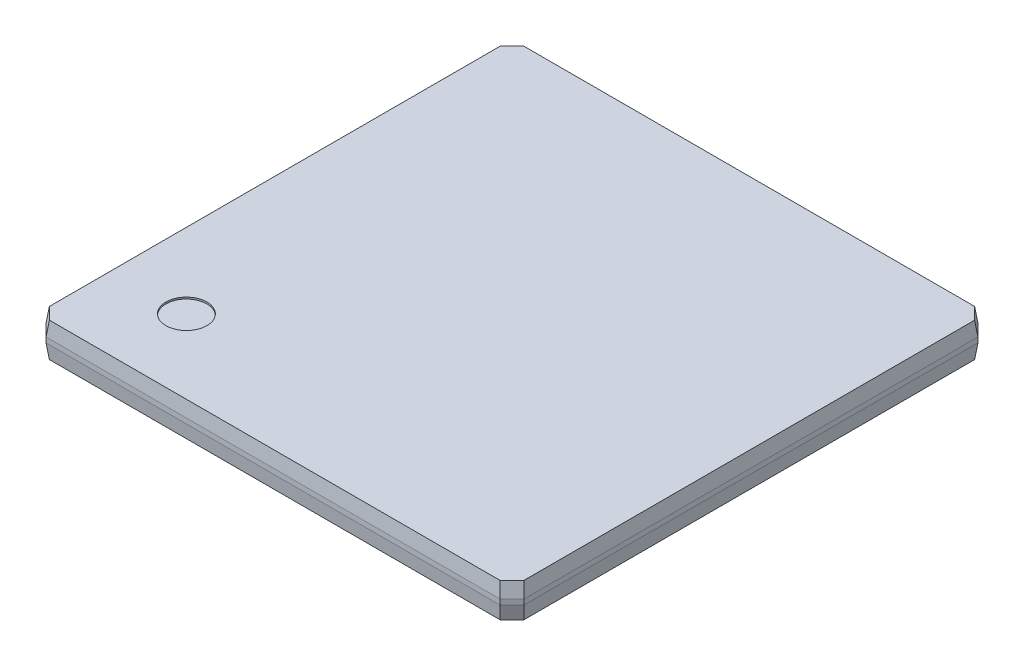
ISO-10303-21;
HEADER;
FILE_DESCRIPTION(('STEP AP214'),'2;1');
FILE_NAME('part.step','',(''),(''),'','','');
FILE_SCHEMA(('AUTOMOTIVE_DESIGN { 1 0 10303 214 1 1 1 1 }'));
ENDSEC;
DATA;
#1=APPLICATION_CONTEXT('core data for automotive mechanical design processes');
#2=APPLICATION_PROTOCOL_DEFINITION('international standard','automotive_design',2000,#1);
#3=PRODUCT_CONTEXT('',#1,'mechanical');
#4=PRODUCT('Part','Part','',(#3));
#5=PRODUCT_RELATED_PRODUCT_CATEGORY('part','',(#4));
#6=PRODUCT_DEFINITION_FORMATION('','',#4);
#7=PRODUCT_DEFINITION_CONTEXT('part definition',#1,'design');
#8=PRODUCT_DEFINITION('design','',#6,#7);
#9=PRODUCT_DEFINITION_SHAPE('','',#8);
#10=(LENGTH_UNIT() NAMED_UNIT(*) SI_UNIT(.MILLI.,.METRE.));
#11=(NAMED_UNIT(*) PLANE_ANGLE_UNIT() SI_UNIT($,.RADIAN.));
#12=(NAMED_UNIT(*) SI_UNIT($,.STERADIAN.) SOLID_ANGLE_UNIT());
#13=UNCERTAINTY_MEASURE_WITH_UNIT(LENGTH_MEASURE(1.E-05),#10,'distance_accuracy_value','');
#14=(GEOMETRIC_REPRESENTATION_CONTEXT(3) GLOBAL_UNCERTAINTY_ASSIGNED_CONTEXT((#13)) GLOBAL_UNIT_ASSIGNED_CONTEXT((#10,
#11,#12)) REPRESENTATION_CONTEXT('',''));
#15=CARTESIAN_POINT('',(0.,0.,0.));
#16=DIRECTION('',(0.,0.,1.));
#17=DIRECTION('',(1.,0.,0.));
#18=AXIS2_PLACEMENT_3D('',#15,#16,#17);
#19=CARTESIAN_POINT('',(80.7672796453876,171.356668809019,4.76220926821013));
#20=DIRECTION('',(0.,-1.,0.));
#21=DIRECTION('',(1.,0.,0.));
#22=AXIS2_PLACEMENT_3D('',#19,#20,#21);
#23=CYLINDRICAL_SURFACE('',#22,0.599999999999989);
#24=CARTESIAN_POINT('',(80.7672796453876,171.356415940122,4.76220926821013));
#25=DIRECTION('',(0.,-1.,0.));
#26=DIRECTION('',(1.,0.,0.));
#27=AXIS2_PLACEMENT_3D('',#24,#25,#26);
#28=CIRCLE('',#27,0.599999999999989);
#29=CARTESIAN_POINT('',(80.1672796453876,171.356415940122,4.76220926821013));
#30=VERTEX_POINT('',#29);
#31=CARTESIAN_POINT('',(81.3672796453876,171.356415940122,4.76220926821013));
#32=VERTEX_POINT('',#31);
#33=EDGE_CURVE('E11',#30,#32,#28,.T.);
#34=ORIENTED_EDGE('',*,*,#33,.F.);
#35=DIRECTION('',(0.,-1.,0.));
#36=VECTOR('',#35,1.);
#37=CARTESIAN_POINT('',(80.1672796453876,171.356668809019,4.76220926821013));
#38=LINE('',#37,#36);
#39=CARTESIAN_POINT('',(80.1672796453876,171.306668809019,4.76220926821013));
#40=VERTEX_POINT('',#39);
#41=EDGE_CURVE('E24',#30,#40,#38,.T.);
#42=ORIENTED_EDGE('',*,*,#41,.T.);
#43=CARTESIAN_POINT('',(80.7672796453876,171.306668809019,4.76220926821013));
#44=DIRECTION('',(0.,1.,0.));
#45=DIRECTION('',(1.,0.,0.));
#46=AXIS2_PLACEMENT_3D('',#43,#44,#45);
#47=CIRCLE('',#46,0.599999999999989);
#48=CARTESIAN_POINT('',(81.3672796453876,171.306668809019,4.76220926821013));
#49=VERTEX_POINT('',#48);
#50=EDGE_CURVE('E310',#49,#40,#47,.T.);
#51=ORIENTED_EDGE('',*,*,#50,.F.);
#52=DIRECTION('',(0.,-1.,0.));
#53=VECTOR('',#52,1.);
#54=CARTESIAN_POINT('',(81.3672796453876,171.356668809019,4.76220926821013));
#55=LINE('',#54,#53);
#56=EDGE_CURVE('E37',#32,#49,#55,.T.);
#57=ORIENTED_EDGE('',*,*,#56,.F.);
#58=EDGE_LOOP('',(#34,#42,#51,#57));
#59=FACE_BOUND('',#58,.T.);
#60=ADVANCED_FACE('F17',(#59),#23,.F.);
#61=CARTESIAN_POINT('',(85.5226880897936,170.356415940122,-0.0195057377945647));
#62=DIRECTION('',(0.,-1.,0.));
#63=DIRECTION('',(1.,0.,0.));
#64=AXIS2_PLACEMENT_3D('',#61,#62,#63);
#65=PLANE('',#64);
#66=DIRECTION('',(0.,0.,1.));
#67=VECTOR('',#66,1.);
#68=CARTESIAN_POINT('',(92.4726880897936,170.356415940122,-0.0195057377945647));
#69=LINE('',#68,#67);
#70=CARTESIAN_POINT('',(92.4726880897936,170.356415940122,-6.6195057377946));
#71=VERTEX_POINT('',#70);
#72=CARTESIAN_POINT('',(92.4726880897936,170.356415940122,6.5804942622055));
#73=VERTEX_POINT('',#72);
#74=EDGE_CURVE('E307',#71,#73,#69,.T.);
#75=ORIENTED_EDGE('',*,*,#74,.T.);
#76=DIRECTION('',(-0.707106781186596,0.,0.707106781186499));
#77=VECTOR('',#76,1.);
#78=CARTESIAN_POINT('',(92.4726880897937,170.356415940122,6.58049426220548));
#79=LINE('',#78,#77);
#80=CARTESIAN_POINT('',(92.1226880897937,170.356415940122,6.93049426220545));
#81=VERTEX_POINT('',#80);
#82=EDGE_CURVE('E305',#73,#81,#79,.T.);
#83=ORIENTED_EDGE('',*,*,#82,.T.);
#84=DIRECTION('',(-1.,0.,0.));
#85=VECTOR('',#84,1.);
#86=CARTESIAN_POINT('',(85.5226880897936,170.356415940122,6.93049426220545));
#87=LINE('',#86,#85);
#88=CARTESIAN_POINT('',(78.9226880897936,170.356415940122,6.93049426220545));
#89=VERTEX_POINT('',#88);
#90=EDGE_CURVE('E303',#81,#89,#87,.T.);
#91=ORIENTED_EDGE('',*,*,#90,.T.);
#92=DIRECTION('',(-0.707106781186547,0.,-0.707106781186548));
#93=VECTOR('',#92,1.);
#94=CARTESIAN_POINT('',(78.9226880897936,170.356415940122,6.93049426220547));
#95=LINE('',#94,#93);
#96=CARTESIAN_POINT('',(78.5726880897936,170.356415940122,6.58049426220548));
#97=VERTEX_POINT('',#96);
#98=EDGE_CURVE('E301',#89,#97,#95,.T.);
#99=ORIENTED_EDGE('',*,*,#98,.T.);
#100=DIRECTION('',(0.,0.,-1.));
#101=VECTOR('',#100,1.);
#102=CARTESIAN_POINT('',(78.5726880897936,170.356415940122,-0.0195057377945647));
#103=LINE('',#102,#101);
#104=CARTESIAN_POINT('',(78.5726880897936,170.356415940122,-6.61950573779457));
#105=VERTEX_POINT('',#104);
#106=EDGE_CURVE('E299',#97,#105,#103,.T.);
#107=ORIENTED_EDGE('',*,*,#106,.T.);
#108=DIRECTION('',(0.707106781186536,0.,-0.707106781186559));
#109=VECTOR('',#108,1.);
#110=CARTESIAN_POINT('',(78.5726880897936,170.356415940122,-6.61950573779457));
#111=LINE('',#110,#109);
#112=CARTESIAN_POINT('',(78.9226880897936,170.356415940122,-6.96950573779457));
#113=VERTEX_POINT('',#112);
#114=EDGE_CURVE('E297',#105,#113,#111,.T.);
#115=ORIENTED_EDGE('',*,*,#114,.T.);
#116=DIRECTION('',(1.,0.,0.));
#117=VECTOR('',#116,1.);
#118=CARTESIAN_POINT('',(85.5226880897936,170.356415940122,-6.96950573779457));
#119=LINE('',#118,#117);
#120=CARTESIAN_POINT('',(92.1226880897936,170.356415940122,-6.96950573779458));
#121=VERTEX_POINT('',#120);
#122=EDGE_CURVE('E295',#113,#121,#119,.T.);
#123=ORIENTED_EDGE('',*,*,#122,.T.);
#124=DIRECTION('',(0.707106781186564,0.,0.707106781186531));
#125=VECTOR('',#124,1.);
#126=CARTESIAN_POINT('',(92.1226880897936,170.356415940122,-6.9695057377946));
#127=LINE('',#126,#125);
#128=EDGE_CURVE('E292',#121,#71,#127,.T.);
#129=ORIENTED_EDGE('',*,*,#128,.T.);
#130=EDGE_LOOP('',(#75,#83,#91,#99,#107,#115,#123,#129));
#131=FACE_BOUND('',#130,.T.);
#132=ADVANCED_FACE('F323',(#131),#65,.T.);
#133=CARTESIAN_POINT('',(92.3226880897936,170.568915940122,6.78049426220546));
#134=DIRECTION('',(-0.697518448882894,0.164121987972366,-0.697518448882895));
#135=DIRECTION('',(-0.707106781186548,0.,0.707106781186547));
#136=AXIS2_PLACEMENT_3D('',#133,#134,#135);
#137=PLANE('',#136);
#138=DIRECTION('',(0.116051770637077,0.986440050415634,0.116051770637077));
#139=VECTOR('',#138,1.);
#140=CARTESIAN_POINT('',(92.1476880897936,170.568915940122,6.95549426220541));
#141=LINE('',#140,#139);
#142=CARTESIAN_POINT('',(92.1726880897936,170.781415940122,6.98049426220541));
#143=VERTEX_POINT('',#142);
#144=EDGE_CURVE('E290',#81,#143,#141,.T.);
#145=ORIENTED_EDGE('',*,*,#144,.F.);
#146=ORIENTED_EDGE('',*,*,#82,.F.);
#147=DIRECTION('',(-0.116051770637077,-0.986440050415634,-0.116051770637077));
#148=VECTOR('',#147,1.);
#149=CARTESIAN_POINT('',(92.4976880897936,170.568915940122,6.60549426220545));
#150=LINE('',#149,#148);
#151=CARTESIAN_POINT('',(92.5226880897936,170.781415940122,6.63049426220542));
#152=VERTEX_POINT('',#151);
#153=EDGE_CURVE('E287',#152,#73,#150,.T.);
#154=ORIENTED_EDGE('',*,*,#153,.F.);
#155=DIRECTION('',(0.707106781186548,0.,-0.707106781186547));
#156=VECTOR('',#155,1.);
#157=CARTESIAN_POINT('',(92.3476880897936,170.781415940122,6.80549426220545));
#158=LINE('',#157,#156);
#159=EDGE_CURVE('E284',#143,#152,#158,.T.);
#160=ORIENTED_EDGE('',*,*,#159,.F.);
#161=EDGE_LOOP('',(#145,#146,#154,#160));
#162=FACE_BOUND('',#161,.T.);
#163=ADVANCED_FACE('F327',(#162),#137,.F.);
#164=CARTESIAN_POINT('',(92.4976880897936,170.568915940122,-0.0195057377945549));
#165=DIRECTION('',(-0.993150604322885,0.116841247567319,0.));
#166=DIRECTION('',(-0.116841247567319,-0.993150604322885,0.));
#167=AXIS2_PLACEMENT_3D('',#164,#165,#166);
#168=PLANE('',#167);
#169=ORIENTED_EDGE('',*,*,#153,.T.);
#170=ORIENTED_EDGE('',*,*,#74,.F.);
#171=DIRECTION('',(-0.116051770637054,-0.986440050415638,0.116051770637062));
#172=VECTOR('',#171,1.);
#173=CARTESIAN_POINT('',(92.5226880897935,170.781415940122,-6.66950573779457));
#174=LINE('',#173,#172);
#175=CARTESIAN_POINT('',(92.5226880897935,170.781415940122,-6.6695057377946));
#176=VERTEX_POINT('',#175);
#177=EDGE_CURVE('E281',#176,#71,#174,.T.);
#178=ORIENTED_EDGE('',*,*,#177,.F.);
#179=DIRECTION('',(0.,0.,-1.));
#180=VECTOR('',#179,1.);
#181=CARTESIAN_POINT('',(92.5226880897935,170.781415940122,-0.0195057377945549));
#182=LINE('',#181,#180);
#183=EDGE_CURVE('E278',#152,#176,#182,.T.);
#184=ORIENTED_EDGE('',*,*,#183,.F.);
#185=EDGE_LOOP('',(#169,#170,#178,#184));
#186=FACE_BOUND('',#185,.T.);
#187=ADVANCED_FACE('F332',(#186),#168,.F.);
#188=CARTESIAN_POINT('',(92.3226880897936,170.568915940122,-6.81950573779458));
#189=DIRECTION('',(-0.697518448882897,0.164121987972341,0.697518448882898));
#190=DIRECTION('',(0.707106781186548,0.,0.707106781186547));
#191=AXIS2_PLACEMENT_3D('',#188,#189,#190);
#192=PLANE('',#191);
#193=ORIENTED_EDGE('',*,*,#177,.T.);
#194=ORIENTED_EDGE('',*,*,#128,.F.);
#195=DIRECTION('',(-0.116051770637059,-0.986440050415638,0.116051770637059));
#196=VECTOR('',#195,1.);
#197=CARTESIAN_POINT('',(92.1476880897936,170.568915940122,-6.99450573779456));
#198=LINE('',#197,#196);
#199=CARTESIAN_POINT('',(92.1726880897936,170.781415940122,-7.01950573779459));
#200=VERTEX_POINT('',#199);
#201=EDGE_CURVE('E275',#200,#121,#198,.T.);
#202=ORIENTED_EDGE('',*,*,#201,.F.);
#203=DIRECTION('',(-0.707106781186548,0.,-0.707106781186547));
#204=VECTOR('',#203,1.);
#205=CARTESIAN_POINT('',(92.3476880897936,170.781415940122,-6.84450573779456));
#206=LINE('',#205,#204);
#207=EDGE_CURVE('E272',#176,#200,#206,.T.);
#208=ORIENTED_EDGE('',*,*,#207,.F.);
#209=EDGE_LOOP('',(#193,#194,#202,#208));
#210=FACE_BOUND('',#209,.T.);
#211=ADVANCED_FACE('F338',(#210),#192,.F.);
#212=CARTESIAN_POINT('',(85.5226880897936,170.568915940122,-6.99450573779457));
#213=DIRECTION('',(0.,0.116841247567315,0.993150604322886));
#214=DIRECTION('',(0.,-0.993150604322886,0.116841247567315));
#215=AXIS2_PLACEMENT_3D('',#212,#213,#214);
#216=PLANE('',#215);
#217=ORIENTED_EDGE('',*,*,#201,.T.);
#218=ORIENTED_EDGE('',*,*,#122,.F.);
#219=DIRECTION('',(0.116051770637118,-0.986440050415632,0.11605177063705));
#220=VECTOR('',#219,1.);
#221=CARTESIAN_POINT('',(78.8726880897936,170.781415940122,-7.01950573779455));
#222=LINE('',#221,#220);
#223=CARTESIAN_POINT('',(78.8726880897935,170.781415940122,-7.0195057377946));
#224=VERTEX_POINT('',#223);
#225=EDGE_CURVE('E269',#224,#113,#222,.T.);
#226=ORIENTED_EDGE('',*,*,#225,.F.);
#227=DIRECTION('',(-1.,0.,0.));
#228=VECTOR('',#227,1.);
#229=CARTESIAN_POINT('',(85.5226880897936,170.781415940122,-7.01950573779455));
#230=LINE('',#229,#228);
#231=EDGE_CURVE('E266',#200,#224,#230,.T.);
#232=ORIENTED_EDGE('',*,*,#231,.F.);
#233=EDGE_LOOP('',(#217,#218,#226,#232));
#234=FACE_BOUND('',#233,.T.);
#235=ADVANCED_FACE('F342',(#234),#216,.F.);
#236=CARTESIAN_POINT('',(78.7226880897936,170.568915940122,-6.81950573779456));
#237=DIRECTION('',(0.697518448882883,0.164121987972467,0.697518448882883));
#238=DIRECTION('',(0.707106781186548,0.,-0.707106781186548));
#239=AXIS2_PLACEMENT_3D('',#236,#237,#238);
#240=PLANE('',#239);
#241=ORIENTED_EDGE('',*,*,#225,.T.);
#242=ORIENTED_EDGE('',*,*,#114,.F.);
#243=DIRECTION('',(0.116051770637148,-0.986440050415617,0.116051770637148));
#244=VECTOR('',#243,1.);
#245=CARTESIAN_POINT('',(78.5476880897936,170.568915940122,-6.64450573779457));
#246=LINE('',#245,#244);
#247=CARTESIAN_POINT('',(78.5226880897936,170.781415940122,-6.66950573779462));
#248=VERTEX_POINT('',#247);
#249=EDGE_CURVE('E263',#248,#105,#246,.T.);
#250=ORIENTED_EDGE('',*,*,#249,.F.);
#251=DIRECTION('',(-0.707106781186548,0.,0.707106781186548));
#252=VECTOR('',#251,1.);
#253=CARTESIAN_POINT('',(78.6976880897936,170.781415940122,-6.84450573779456));
#254=LINE('',#253,#252);
#255=EDGE_CURVE('E260',#224,#248,#254,.T.);
#256=ORIENTED_EDGE('',*,*,#255,.F.);
#257=EDGE_LOOP('',(#241,#242,#250,#256));
#258=FACE_BOUND('',#257,.T.);
#259=ADVANCED_FACE('F346',(#258),#240,.F.);
#260=CARTESIAN_POINT('',(78.5476880897936,170.568915940122,-0.0195057377945593));
#261=DIRECTION('',(0.993150604322868,0.116841247567469,0.));
#262=DIRECTION('',(-0.116841247567469,0.993150604322868,0.));
#263=AXIS2_PLACEMENT_3D('',#260,#261,#262);
#264=PLANE('',#263);
#265=ORIENTED_EDGE('',*,*,#249,.T.);
#266=ORIENTED_EDGE('',*,*,#106,.F.);
#267=DIRECTION('',(0.116051770637182,-0.986440050415624,-0.116051770637059));
#268=VECTOR('',#267,1.);
#269=CARTESIAN_POINT('',(78.5226880897935,170.781415940122,6.63049426220545));
#270=LINE('',#269,#268);
#271=CARTESIAN_POINT('',(78.5226880897936,170.781415940122,6.63049426220542));
#272=VERTEX_POINT('',#271);
#273=EDGE_CURVE('E257',#272,#97,#270,.T.);
#274=ORIENTED_EDGE('',*,*,#273,.F.);
#275=DIRECTION('',(0.,0.,1.));
#276=VECTOR('',#275,1.);
#277=CARTESIAN_POINT('',(78.5226880897935,170.781415940122,-0.0195057377945593));
#278=LINE('',#277,#276);
#279=EDGE_CURVE('E254',#248,#272,#278,.T.);
#280=ORIENTED_EDGE('',*,*,#279,.F.);
#281=EDGE_LOOP('',(#265,#266,#274,#280));
#282=FACE_BOUND('',#281,.T.);
#283=ADVANCED_FACE('F350',(#282),#264,.F.);
#284=CARTESIAN_POINT('',(78.7226880897936,170.568915940122,6.78049426220546));
#285=DIRECTION('',(0.697518448882886,0.164121987972441,-0.697518448882885));
#286=DIRECTION('',(-0.707106781186547,0.,-0.707106781186548));
#287=AXIS2_PLACEMENT_3D('',#284,#285,#286);
#288=PLANE('',#287);
#289=ORIENTED_EDGE('',*,*,#273,.T.);
#290=ORIENTED_EDGE('',*,*,#98,.F.);
#291=DIRECTION('',(0.11605177063713,-0.986440050415622,-0.11605177063713));
#292=VECTOR('',#291,1.);
#293=CARTESIAN_POINT('',(78.8976880897936,170.568915940122,6.95549426220545));
#294=LINE('',#293,#292);
#295=CARTESIAN_POINT('',(78.8726880897936,170.781415940122,6.98049426220541));
#296=VERTEX_POINT('',#295);
#297=EDGE_CURVE('E251',#296,#89,#294,.T.);
#298=ORIENTED_EDGE('',*,*,#297,.F.);
#299=DIRECTION('',(0.707106781186547,0.,0.707106781186548));
#300=VECTOR('',#299,1.);
#301=CARTESIAN_POINT('',(78.6976880897936,170.781415940122,6.80549426220546));
#302=LINE('',#301,#300);
#303=EDGE_CURVE('E248',#272,#296,#302,.T.);
#304=ORIENTED_EDGE('',*,*,#303,.F.);
#305=EDGE_LOOP('',(#289,#290,#298,#304));
#306=FACE_BOUND('',#305,.T.);
#307=ADVANCED_FACE('F354',(#306),#288,.F.);
#308=CARTESIAN_POINT('',(85.5226880897936,170.568915940122,6.95549426220545));
#309=DIRECTION('',(0.,0.116841247567396,-0.993150604322876));
#310=DIRECTION('',(0.,0.993150604322876,0.116841247567396));
#311=AXIS2_PLACEMENT_3D('',#308,#309,#310);
#312=PLANE('',#311);
#313=ORIENTED_EDGE('',*,*,#297,.T.);
#314=ORIENTED_EDGE('',*,*,#90,.F.);
#315=ORIENTED_EDGE('',*,*,#144,.T.);
#316=DIRECTION('',(1.,0.,0.));
#317=VECTOR('',#316,1.);
#318=CARTESIAN_POINT('',(85.5226880897936,170.781415940122,6.98049426220545));
#319=LINE('',#318,#317);
#320=EDGE_CURVE('E245',#296,#143,#319,.T.);
#321=ORIENTED_EDGE('',*,*,#320,.F.);
#322=EDGE_LOOP('',(#313,#314,#315,#321));
#323=FACE_BOUND('',#322,.T.);
#324=ADVANCED_FACE('F358',(#323),#312,.F.);
#325=CARTESIAN_POINT('',(92.3476880897936,170.781415940122,6.80549426220539));
#326=DIRECTION('',(0.707106781186547,0.,0.707106781186548));
#327=DIRECTION('',(0.707106781186548,0.,-0.707106781186547));
#328=AXIS2_PLACEMENT_3D('',#325,#326,#327);
#329=PLANE('',#328);
#330=ORIENTED_EDGE('',*,*,#159,.T.);
#331=DIRECTION('',(0.,1.,0.));
#332=VECTOR('',#331,1.);
#333=CARTESIAN_POINT('',(92.5226880897935,170.781415940122,6.63049426220542));
#334=LINE('',#333,#332);
#335=CARTESIAN_POINT('',(92.5226880897935,170.931415940122,6.63049426220539));
#336=VERTEX_POINT('',#335);
#337=EDGE_CURVE('E243',#152,#336,#334,.T.);
#338=ORIENTED_EDGE('',*,*,#337,.T.);
#339=DIRECTION('',(-0.707106781186548,0.,0.707106781186547));
#340=VECTOR('',#339,1.);
#341=CARTESIAN_POINT('',(92.3476880897936,170.931415940122,6.80549426220539));
#342=LINE('',#341,#340);
#343=CARTESIAN_POINT('',(92.1726880897936,170.931415940122,6.98049426220534));
#344=VERTEX_POINT('',#343);
#345=EDGE_CURVE('E241',#336,#344,#342,.T.);
#346=ORIENTED_EDGE('',*,*,#345,.T.);
#347=DIRECTION('',(0.,-1.,0.));
#348=VECTOR('',#347,1.);
#349=CARTESIAN_POINT('',(92.1726880897936,170.781415940122,6.9804942622054));
#350=LINE('',#349,#348);
#351=EDGE_CURVE('E238',#344,#143,#350,.T.);
#352=ORIENTED_EDGE('',*,*,#351,.T.);
#353=EDGE_LOOP('',(#330,#338,#346,#352));
#354=FACE_BOUND('',#353,.T.);
#355=ADVANCED_FACE('F362',(#354),#329,.T.);
#356=CARTESIAN_POINT('',(92.5226880897936,170.781415940122,-0.0195057377946242));
#357=DIRECTION('',(1.,0.,0.));
#358=DIRECTION('',(0.,0.,-1.));
#359=AXIS2_PLACEMENT_3D('',#356,#357,#358);
#360=PLANE('',#359);
#361=ORIENTED_EDGE('',*,*,#183,.T.);
#362=DIRECTION('',(0.,1.,0.));
#363=VECTOR('',#362,1.);
#364=CARTESIAN_POINT('',(92.5226880897936,170.781415940122,-6.66950573779457));
#365=LINE('',#364,#363);
#366=CARTESIAN_POINT('',(92.5226880897935,170.931415940122,-6.66950573779462));
#367=VERTEX_POINT('',#366);
#368=EDGE_CURVE('E236',#176,#367,#365,.T.);
#369=ORIENTED_EDGE('',*,*,#368,.T.);
#370=DIRECTION('',(0.,0.,1.));
#371=VECTOR('',#370,1.);
#372=CARTESIAN_POINT('',(92.5226880897936,170.931415940122,-0.0195057377946242));
#373=LINE('',#372,#371);
#374=EDGE_CURVE('E233',#367,#336,#373,.T.);
#375=ORIENTED_EDGE('',*,*,#374,.T.);
#376=ORIENTED_EDGE('',*,*,#337,.F.);
#377=EDGE_LOOP('',(#361,#369,#375,#376));
#378=FACE_BOUND('',#377,.T.);
#379=ADVANCED_FACE('F366',(#378),#360,.T.);
#380=CARTESIAN_POINT('',(92.3476880897936,170.781415940122,-6.84450573779461));
#381=DIRECTION('',(0.707106781186548,0.,-0.707106781186547));
#382=DIRECTION('',(-0.707106781186547,0.,-0.707106781186548));
#383=AXIS2_PLACEMENT_3D('',#380,#381,#382);
#384=PLANE('',#383);
#385=ORIENTED_EDGE('',*,*,#207,.T.);
#386=DIRECTION('',(0.,1.,0.));
#387=VECTOR('',#386,1.);
#388=CARTESIAN_POINT('',(92.1726880897936,170.781415940122,-7.01950573779459));
#389=LINE('',#388,#387);
#390=CARTESIAN_POINT('',(92.1726880897936,170.931415940122,-7.01950573779466));
#391=VERTEX_POINT('',#390);
#392=EDGE_CURVE('E231',#200,#391,#389,.T.);
#393=ORIENTED_EDGE('',*,*,#392,.T.);
#394=DIRECTION('',(0.707106781186547,0.,0.707106781186548));
#395=VECTOR('',#394,1.);
#396=CARTESIAN_POINT('',(92.3476880897936,170.931415940122,-6.84450573779461));
#397=LINE('',#396,#395);
#398=EDGE_CURVE('E228',#391,#367,#397,.T.);
#399=ORIENTED_EDGE('',*,*,#398,.T.);
#400=ORIENTED_EDGE('',*,*,#368,.F.);
#401=EDGE_LOOP('',(#385,#393,#399,#400));
#402=FACE_BOUND('',#401,.T.);
#403=ADVANCED_FACE('F370',(#402),#384,.T.);
#404=CARTESIAN_POINT('',(85.5226880897936,170.781415940122,-7.01950573779461));
#405=DIRECTION('',(0.,0.,-1.));
#406=DIRECTION('',(-1.,0.,0.));
#407=AXIS2_PLACEMENT_3D('',#404,#405,#406);
#408=PLANE('',#407);
#409=ORIENTED_EDGE('',*,*,#231,.T.);
#410=DIRECTION('',(0.,1.,0.));
#411=VECTOR('',#410,1.);
#412=CARTESIAN_POINT('',(78.8726880897936,170.781415940122,-7.01950573779461));
#413=LINE('',#412,#411);
#414=CARTESIAN_POINT('',(78.8726880897935,170.931415940122,-7.01950573779465));
#415=VERTEX_POINT('',#414);
#416=EDGE_CURVE('E226',#224,#415,#413,.T.);
#417=ORIENTED_EDGE('',*,*,#416,.T.);
#418=DIRECTION('',(1.,0.,0.));
#419=VECTOR('',#418,1.);
#420=CARTESIAN_POINT('',(85.5226880897936,170.931415940122,-7.01950573779461));
#421=LINE('',#420,#419);
#422=EDGE_CURVE('E223',#415,#391,#421,.T.);
#423=ORIENTED_EDGE('',*,*,#422,.T.);
#424=ORIENTED_EDGE('',*,*,#392,.F.);
#425=EDGE_LOOP('',(#409,#417,#423,#424));
#426=FACE_BOUND('',#425,.T.);
#427=ADVANCED_FACE('F374',(#426),#408,.T.);
#428=CARTESIAN_POINT('',(78.6976880897935,170.781415940122,-6.84450573779464));
#429=DIRECTION('',(-0.707106781186547,0.,-0.707106781186548));
#430=DIRECTION('',(-0.707106781186548,0.,0.707106781186547));
#431=AXIS2_PLACEMENT_3D('',#428,#429,#430);
#432=PLANE('',#431);
#433=ORIENTED_EDGE('',*,*,#255,.T.);
#434=DIRECTION('',(0.,1.,0.));
#435=VECTOR('',#434,1.);
#436=CARTESIAN_POINT('',(78.5226880897935,170.781415940122,-6.66950573779466));
#437=LINE('',#436,#435);
#438=CARTESIAN_POINT('',(78.5226880897935,170.931415940122,-6.66950573779466));
#439=VERTEX_POINT('',#438);
#440=EDGE_CURVE('E221',#248,#439,#437,.T.);
#441=ORIENTED_EDGE('',*,*,#440,.T.);
#442=DIRECTION('',(0.707106781186548,0.,-0.707106781186547));
#443=VECTOR('',#442,1.);
#444=CARTESIAN_POINT('',(78.6976880897935,170.931415940122,-6.84450573779464));
#445=LINE('',#444,#443);
#446=EDGE_CURVE('E218',#439,#415,#445,.T.);
#447=ORIENTED_EDGE('',*,*,#446,.T.);
#448=ORIENTED_EDGE('',*,*,#416,.F.);
#449=EDGE_LOOP('',(#433,#441,#447,#448));
#450=FACE_BOUND('',#449,.T.);
#451=ADVANCED_FACE('F378',(#450),#432,.T.);
#452=CARTESIAN_POINT('',(78.5226880897936,170.781415940122,-0.0195057377946259));
#453=DIRECTION('',(-1.,0.,0.));
#454=DIRECTION('',(0.,0.,1.));
#455=AXIS2_PLACEMENT_3D('',#452,#453,#454);
#456=PLANE('',#455);
#457=ORIENTED_EDGE('',*,*,#279,.T.);
#458=DIRECTION('',(0.,1.,0.));
#459=VECTOR('',#458,1.);
#460=CARTESIAN_POINT('',(78.5226880897936,170.781415940122,6.63049426220545));
#461=LINE('',#460,#459);
#462=CARTESIAN_POINT('',(78.5226880897936,170.931415940122,6.6304942622054));
#463=VERTEX_POINT('',#462);
#464=EDGE_CURVE('E216',#272,#463,#461,.T.);
#465=ORIENTED_EDGE('',*,*,#464,.T.);
#466=DIRECTION('',(0.,0.,-1.));
#467=VECTOR('',#466,1.);
#468=CARTESIAN_POINT('',(78.5226880897936,170.931415940122,-0.0195057377946259));
#469=LINE('',#468,#467);
#470=EDGE_CURVE('E213',#463,#439,#469,.T.);
#471=ORIENTED_EDGE('',*,*,#470,.T.);
#472=ORIENTED_EDGE('',*,*,#440,.F.);
#473=EDGE_LOOP('',(#457,#465,#471,#472));
#474=FACE_BOUND('',#473,.T.);
#475=ADVANCED_FACE('F382',(#474),#456,.T.);
#476=CARTESIAN_POINT('',(78.6976880897936,170.781415940122,6.80549426220536));
#477=DIRECTION('',(-0.707106781186548,0.,0.707106781186547));
#478=DIRECTION('',(0.707106781186547,0.,0.707106781186548));
#479=AXIS2_PLACEMENT_3D('',#476,#477,#478);
#480=PLANE('',#479);
#481=ORIENTED_EDGE('',*,*,#303,.T.);
#482=DIRECTION('',(0.,1.,0.));
#483=VECTOR('',#482,1.);
#484=CARTESIAN_POINT('',(78.8726880897936,170.781415940122,6.9804942622054));
#485=LINE('',#484,#483);
#486=CARTESIAN_POINT('',(78.8726880897936,170.931415940122,6.98049426220532));
#487=VERTEX_POINT('',#486);
#488=EDGE_CURVE('E211',#296,#487,#485,.T.);
#489=ORIENTED_EDGE('',*,*,#488,.T.);
#490=DIRECTION('',(-0.707106781186547,0.,-0.707106781186548));
#491=VECTOR('',#490,1.);
#492=CARTESIAN_POINT('',(78.6976880897936,170.931415940122,6.80549426220536));
#493=LINE('',#492,#491);
#494=EDGE_CURVE('E148',#487,#463,#493,.T.);
#495=ORIENTED_EDGE('',*,*,#494,.T.);
#496=ORIENTED_EDGE('',*,*,#464,.F.);
#497=EDGE_LOOP('',(#481,#489,#495,#496));
#498=FACE_BOUND('',#497,.T.);
#499=ADVANCED_FACE('F386',(#498),#480,.T.);
#500=CARTESIAN_POINT('',(85.5226880897935,170.781415940122,6.98049426220539));
#501=DIRECTION('',(0.,0.,1.));
#502=DIRECTION('',(1.,0.,0.));
#503=AXIS2_PLACEMENT_3D('',#500,#501,#502);
#504=PLANE('',#503);
#505=ORIENTED_EDGE('',*,*,#320,.T.);
#506=ORIENTED_EDGE('',*,*,#351,.F.);
#507=DIRECTION('',(-1.,0.,0.));
#508=VECTOR('',#507,1.);
#509=CARTESIAN_POINT('',(85.5226880897935,170.931415940122,6.98049426220539));
#510=LINE('',#509,#508);
#511=EDGE_CURVE('E208',#344,#487,#510,.T.);
#512=ORIENTED_EDGE('',*,*,#511,.T.);
#513=ORIENTED_EDGE('',*,*,#488,.F.);
#514=EDGE_LOOP('',(#505,#506,#512,#513));
#515=FACE_BOUND('',#514,.T.);
#516=ADVANCED_FACE('F390',(#515),#504,.T.);
#517=CARTESIAN_POINT('',(92.3226880897935,171.143915940122,6.78049426220534));
#518=DIRECTION('',(-0.697518448882886,-0.164121987972441,-0.697518448882886));
#519=DIRECTION('',(-0.707106781186548,0.,0.707106781186548));
#520=AXIS2_PLACEMENT_3D('',#517,#518,#519);
#521=PLANE('',#520);
#522=DIRECTION('',(0.11605177063713,-0.986440050415622,0.11605177063713));
#523=VECTOR('',#522,1.);
#524=CARTESIAN_POINT('',(92.4976880897935,171.143915940122,6.60549426220536));
#525=LINE('',#524,#523);
#526=CARTESIAN_POINT('',(92.4726880897935,171.356415940122,6.58049426220535));
#527=VERTEX_POINT('',#526);
#528=EDGE_CURVE('E205',#527,#336,#525,.T.);
#529=ORIENTED_EDGE('',*,*,#528,.F.);
#530=DIRECTION('',(0.707106781186536,0.,-0.707106781186559));
#531=VECTOR('',#530,1.);
#532=CARTESIAN_POINT('',(92.1226880897935,171.356415940122,6.93049426220535));
#533=LINE('',#532,#531);
#534=CARTESIAN_POINT('',(92.1226880897935,171.356415940122,6.93049426220532));
#535=VERTEX_POINT('',#534);
#536=EDGE_CURVE('E203',#535,#527,#533,.T.);
#537=ORIENTED_EDGE('',*,*,#536,.F.);
#538=DIRECTION('',(-0.11605177063713,0.986440050415622,-0.11605177063713));
#539=VECTOR('',#538,1.);
#540=CARTESIAN_POINT('',(92.1476880897935,171.143915940122,6.95549426220533));
#541=LINE('',#540,#539);
#542=EDGE_CURVE('E168',#344,#535,#541,.T.);
#543=ORIENTED_EDGE('',*,*,#542,.F.);
#544=ORIENTED_EDGE('',*,*,#345,.F.);
#545=EDGE_LOOP('',(#529,#537,#543,#544));
#546=FACE_BOUND('',#545,.T.);
#547=ADVANCED_FACE('F394',(#546),#521,.F.);
#548=CARTESIAN_POINT('',(92.4976880897935,171.143915940122,-0.0195057377947192));
#549=DIRECTION('',(-0.993150604322868,-0.116841247567469,0.));
#550=DIRECTION('',(0.116841247567469,-0.993150604322868,0.));
#551=AXIS2_PLACEMENT_3D('',#548,#549,#550);
#552=PLANE('',#551);
#553=DIRECTION('',(0.11605177063719,-0.98644005041563,-0.116051770636997));
#554=VECTOR('',#553,1.);
#555=CARTESIAN_POINT('',(92.4726880897935,171.356415940122,-6.6195057377947));
#556=LINE('',#555,#554);
#557=CARTESIAN_POINT('',(92.4726880897935,171.356415940122,-6.61950573779468));
#558=VERTEX_POINT('',#557);
#559=EDGE_CURVE('E199',#558,#367,#556,.T.);
#560=ORIENTED_EDGE('',*,*,#559,.F.);
#561=DIRECTION('',(0.,0.,-1.));
#562=VECTOR('',#561,1.);
#563=CARTESIAN_POINT('',(92.4726880897935,171.356415940122,-0.0195057377947192));
#564=LINE('',#563,#562);
#565=EDGE_CURVE('E196',#527,#558,#564,.T.);
#566=ORIENTED_EDGE('',*,*,#565,.F.);
#567=ORIENTED_EDGE('',*,*,#528,.T.);
#568=ORIENTED_EDGE('',*,*,#374,.F.);
#569=EDGE_LOOP('',(#560,#566,#567,#568));
#570=FACE_BOUND('',#569,.T.);
#571=ADVANCED_FACE('F398',(#570),#552,.F.);
#572=CARTESIAN_POINT('',(92.3226880897935,171.143915940122,-6.81950573779468));
#573=DIRECTION('',(-0.697518448882883,-0.164121987972467,0.697518448882882));
#574=DIRECTION('',(0.707106781186547,0.,0.707106781186548));
#575=AXIS2_PLACEMENT_3D('',#572,#573,#574);
#576=PLANE('',#575);
#577=DIRECTION('',(0.116051770637149,-0.986440050415617,-0.116051770637148));
#578=VECTOR('',#577,1.);
#579=CARTESIAN_POINT('',(92.1476880897935,171.143915940122,-6.9945057377947));
#580=LINE('',#579,#578);
#581=CARTESIAN_POINT('',(92.1226880897935,171.356415940122,-6.9695057377947));
#582=VERTEX_POINT('',#581);
#583=EDGE_CURVE('E193',#582,#391,#580,.T.);
#584=ORIENTED_EDGE('',*,*,#583,.F.);
#585=DIRECTION('',(-0.707106781186547,0.,-0.707106781186548));
#586=VECTOR('',#585,1.);
#587=CARTESIAN_POINT('',(92.2976880897935,171.356415940122,-6.79450573779468));
#588=LINE('',#587,#586);
#589=EDGE_CURVE('E190',#558,#582,#588,.T.);
#590=ORIENTED_EDGE('',*,*,#589,.F.);
#591=ORIENTED_EDGE('',*,*,#559,.T.);
#592=ORIENTED_EDGE('',*,*,#398,.F.);
#593=EDGE_LOOP('',(#584,#590,#591,#592));
#594=FACE_BOUND('',#593,.T.);
#595=ADVANCED_FACE('F402',(#594),#576,.F.);
#596=CARTESIAN_POINT('',(85.5226880897935,171.143915940122,-6.99450573779469));
#597=DIRECTION('',(0.,-0.116841247567315,0.993150604322886));
#598=DIRECTION('',(0.,-0.993150604322886,-0.116841247567315));
#599=AXIS2_PLACEMENT_3D('',#596,#597,#598);
#600=PLANE('',#599);
#601=DIRECTION('',(-0.116051770637126,-0.986440050415632,-0.116051770637049));
#602=VECTOR('',#601,1.);
#603=CARTESIAN_POINT('',(78.9226880897935,171.356415940122,-6.96950573779471));
#604=LINE('',#603,#602);
#605=CARTESIAN_POINT('',(78.9226880897934,171.356415940122,-6.9695057377947));
#606=VERTEX_POINT('',#605);
#607=EDGE_CURVE('E187',#606,#415,#604,.T.);
#608=ORIENTED_EDGE('',*,*,#607,.F.);
#609=DIRECTION('',(-1.,0.,0.));
#610=VECTOR('',#609,1.);
#611=CARTESIAN_POINT('',(85.5226880897935,171.356415940122,-6.96950573779471));
#612=LINE('',#611,#610);
#613=EDGE_CURVE('E184',#582,#606,#612,.T.);
#614=ORIENTED_EDGE('',*,*,#613,.F.);
#615=ORIENTED_EDGE('',*,*,#583,.T.);
#616=ORIENTED_EDGE('',*,*,#422,.F.);
#617=EDGE_LOOP('',(#608,#614,#615,#616));
#618=FACE_BOUND('',#617,.T.);
#619=ADVANCED_FACE('F406',(#618),#600,.F.);
#620=CARTESIAN_POINT('',(78.7226880897935,171.143915940122,-6.81950573779472));
#621=DIRECTION('',(0.697518448882897,-0.164121987972341,0.697518448882898));
#622=DIRECTION('',(0.707106781186548,0.,-0.707106781186547));
#623=AXIS2_PLACEMENT_3D('',#620,#621,#622);
#624=PLANE('',#623);
#625=DIRECTION('',(-0.116051770637059,-0.986440050415638,-0.116051770637059));
#626=VECTOR('',#625,1.);
#627=CARTESIAN_POINT('',(78.5476880897935,171.143915940122,-6.64450573779473));
#628=LINE('',#627,#626);
#629=CARTESIAN_POINT('',(78.5726880897935,171.356415940122,-6.61950573779474));
#630=VERTEX_POINT('',#629);
#631=EDGE_CURVE('E181',#630,#439,#628,.T.);
#632=ORIENTED_EDGE('',*,*,#631,.F.);
#633=DIRECTION('',(-0.707106781186548,0.,0.707106781186547));
#634=VECTOR('',#633,1.);
#635=CARTESIAN_POINT('',(78.7476880897935,171.356415940122,-6.79450573779474));
#636=LINE('',#635,#634);
#637=EDGE_CURVE('E179',#606,#630,#636,.T.);
#638=ORIENTED_EDGE('',*,*,#637,.F.);
#639=ORIENTED_EDGE('',*,*,#607,.T.);
#640=ORIENTED_EDGE('',*,*,#446,.F.);
#641=EDGE_LOOP('',(#632,#638,#639,#640));
#642=FACE_BOUND('',#641,.T.);
#643=ADVANCED_FACE('F410',(#642),#624,.F.);
#644=CARTESIAN_POINT('',(78.5476880897935,171.143915940122,-0.0195057377946899));
#645=DIRECTION('',(0.993150604322885,-0.116841247567319,0.));
#646=DIRECTION('',(0.116841247567319,0.993150604322885,0.));
#647=AXIS2_PLACEMENT_3D('',#644,#645,#646);
#648=PLANE('',#647);
#649=DIRECTION('',(-0.11605177063706,-0.986440050415618,0.116051770637233));
#650=VECTOR('',#649,1.);
#651=CARTESIAN_POINT('',(78.5726880897935,171.356415940122,6.58049426220535));
#652=LINE('',#651,#650);
#653=CARTESIAN_POINT('',(78.5726880897935,171.356415940122,6.58049426220542));
#654=VERTEX_POINT('',#653);
#655=EDGE_CURVE('E177',#654,#463,#652,.T.);
#656=ORIENTED_EDGE('',*,*,#655,.F.);
#657=DIRECTION('',(0.,0.,1.));
#658=VECTOR('',#657,1.);
#659=CARTESIAN_POINT('',(78.5726880897935,171.356415940122,-0.0195057377946899));
#660=LINE('',#659,#658);
#661=EDGE_CURVE('E153',#630,#654,#660,.T.);
#662=ORIENTED_EDGE('',*,*,#661,.F.);
#663=ORIENTED_EDGE('',*,*,#631,.T.);
#664=ORIENTED_EDGE('',*,*,#470,.F.);
#665=EDGE_LOOP('',(#656,#662,#663,#664));
#666=FACE_BOUND('',#665,.T.);
#667=ADVANCED_FACE('F414',(#666),#648,.F.);
#668=CARTESIAN_POINT('',(78.7226880897935,171.143915940122,6.78049426220531));
#669=DIRECTION('',(0.697518448882895,-0.164121987972366,-0.697518448882894));
#670=DIRECTION('',(-0.707106781186547,0.,-0.707106781186548));
#671=AXIS2_PLACEMENT_3D('',#668,#669,#670);
#672=PLANE('',#671);
#673=DIRECTION('',(-0.116051770637077,-0.986440050415634,0.116051770637077));
#674=VECTOR('',#673,1.);
#675=CARTESIAN_POINT('',(78.8976880897935,171.143915940122,6.95549426220527));
#676=LINE('',#675,#674);
#677=CARTESIAN_POINT('',(78.9226880897934,171.356415940122,6.93049426220531));
#678=VERTEX_POINT('',#677);
#679=EDGE_CURVE('E142',#678,#487,#676,.T.);
#680=ORIENTED_EDGE('',*,*,#679,.F.);
#681=DIRECTION('',(0.707106781186547,0.,0.707106781186548));
#682=VECTOR('',#681,1.);
#683=CARTESIAN_POINT('',(78.7476880897935,171.356415940122,6.75549426220532));
#684=LINE('',#683,#682);
#685=EDGE_CURVE('E146',#654,#678,#684,.T.);
#686=ORIENTED_EDGE('',*,*,#685,.F.);
#687=ORIENTED_EDGE('',*,*,#655,.T.);
#688=ORIENTED_EDGE('',*,*,#494,.F.);
#689=EDGE_LOOP('',(#680,#686,#687,#688));
#690=FACE_BOUND('',#689,.T.);
#691=ADVANCED_FACE('F144',(#690),#672,.F.);
#692=CARTESIAN_POINT('',(85.5226880897935,171.143915940122,6.95549426220531));
#693=DIRECTION('',(0.,-0.116841247567396,-0.993150604322876));
#694=DIRECTION('',(0.,0.993150604322876,-0.116841247567396));
#695=AXIS2_PLACEMENT_3D('',#692,#693,#694);
#696=PLANE('',#695);
#697=ORIENTED_EDGE('',*,*,#542,.T.);
#698=DIRECTION('',(1.,0.,0.));
#699=VECTOR('',#698,1.);
#700=CARTESIAN_POINT('',(85.5226880897935,171.356415940122,6.93049426220531));
#701=LINE('',#700,#699);
#702=EDGE_CURVE('E161',#678,#535,#701,.T.);
#703=ORIENTED_EDGE('',*,*,#702,.F.);
#704=ORIENTED_EDGE('',*,*,#679,.T.);
#705=ORIENTED_EDGE('',*,*,#511,.F.);
#706=EDGE_LOOP('',(#697,#703,#704,#705));
#707=FACE_BOUND('',#706,.T.);
#708=ADVANCED_FACE('F166',(#707),#696,.F.);
#709=CARTESIAN_POINT('',(85.5226880897935,171.356415940122,-0.019505737794721));
#710=DIRECTION('',(0.,1.,0.));
#711=DIRECTION('',(-1.,0.,0.));
#712=AXIS2_PLACEMENT_3D('',#709,#710,#711);
#713=PLANE('',#712);
#714=ORIENTED_EDGE('',*,*,#661,.T.);
#715=ORIENTED_EDGE('',*,*,#685,.T.);
#716=ORIENTED_EDGE('',*,*,#702,.T.);
#717=ORIENTED_EDGE('',*,*,#536,.T.);
#718=ORIENTED_EDGE('',*,*,#565,.T.);
#719=ORIENTED_EDGE('',*,*,#589,.T.);
#720=ORIENTED_EDGE('',*,*,#613,.T.);
#721=ORIENTED_EDGE('',*,*,#637,.T.);
#722=EDGE_LOOP('',(#714,#715,#716,#717,#718,#719,#720,#721));
#723=FACE_BOUND('',#722,.T.);
#724=CARTESIAN_POINT('',(80.7672796453876,171.356415940122,4.76220926821013));
#725=DIRECTION('',(0.,-1.,0.));
#726=DIRECTION('',(1.,0.,0.));
#727=AXIS2_PLACEMENT_3D('',#724,#725,#726);
#728=CIRCLE('',#727,0.599999999999989);
#729=EDGE_CURVE('E169',#32,#30,#728,.T.);
#730=ORIENTED_EDGE('',*,*,#729,.T.);
#731=ORIENTED_EDGE('',*,*,#33,.T.);
#732=EDGE_LOOP('',(#730,#731));
#733=FACE_BOUND('',#732,.T.);
#734=ADVANCED_FACE('F158',(#723,#733),#713,.T.);
#735=CARTESIAN_POINT('',(80.7672796453876,171.356668809019,4.76220926821013));
#736=DIRECTION('',(0.,-1.,0.));
#737=DIRECTION('',(1.,0.,0.));
#738=AXIS2_PLACEMENT_3D('',#735,#736,#737);
#739=CYLINDRICAL_SURFACE('',#738,0.599999999999989);
#740=ORIENTED_EDGE('',*,*,#41,.F.);
#741=ORIENTED_EDGE('',*,*,#729,.F.);
#742=ORIENTED_EDGE('',*,*,#56,.T.);
#743=CARTESIAN_POINT('',(80.7672796453876,171.306668809019,4.76220926821013));
#744=DIRECTION('',(0.,1.,0.));
#745=DIRECTION('',(1.,0.,0.));
#746=AXIS2_PLACEMENT_3D('',#743,#744,#745);
#747=CIRCLE('',#746,0.599999999999989);
#748=EDGE_CURVE('E172',#40,#49,#747,.T.);
#749=ORIENTED_EDGE('',*,*,#748,.F.);
#750=EDGE_LOOP('',(#740,#741,#742,#749));
#751=FACE_BOUND('',#750,.T.);
#752=ADVANCED_FACE('F312',(#751),#739,.F.);
#753=CARTESIAN_POINT('',(81.3672796453876,171.306668809019,4.76220926821007));
#754=DIRECTION('',(0.,1.,0.));
#755=DIRECTION('',(-1.,0.,0.));
#756=AXIS2_PLACEMENT_3D('',#753,#754,#755);
#757=PLANE('',#756);
#758=ORIENTED_EDGE('',*,*,#50,.T.);
#759=ORIENTED_EDGE('',*,*,#748,.T.);
#760=EDGE_LOOP('',(#758,#759));
#761=FACE_BOUND('',#760,.T.);
#762=ADVANCED_FACE('F314',(#761),#757,.T.);
#763=CLOSED_SHELL('',(#60,#132,#163,#187,#211,#235,#259,#283,#307,#324,#355,#379,#403,#427,#451,
#475,#499,#516,#547,#571,#595,#619,#643,#667,#691,#708,#734,#752,#762));
#764=MANIFOLD_SOLID_BREP('B1',#763);
#765=ADVANCED_BREP_SHAPE_REPRESENTATION('',(#18,#764),#14);
#766=SHAPE_DEFINITION_REPRESENTATION(#9,#765);
ENDSEC;
END-ISO-10303-21;
